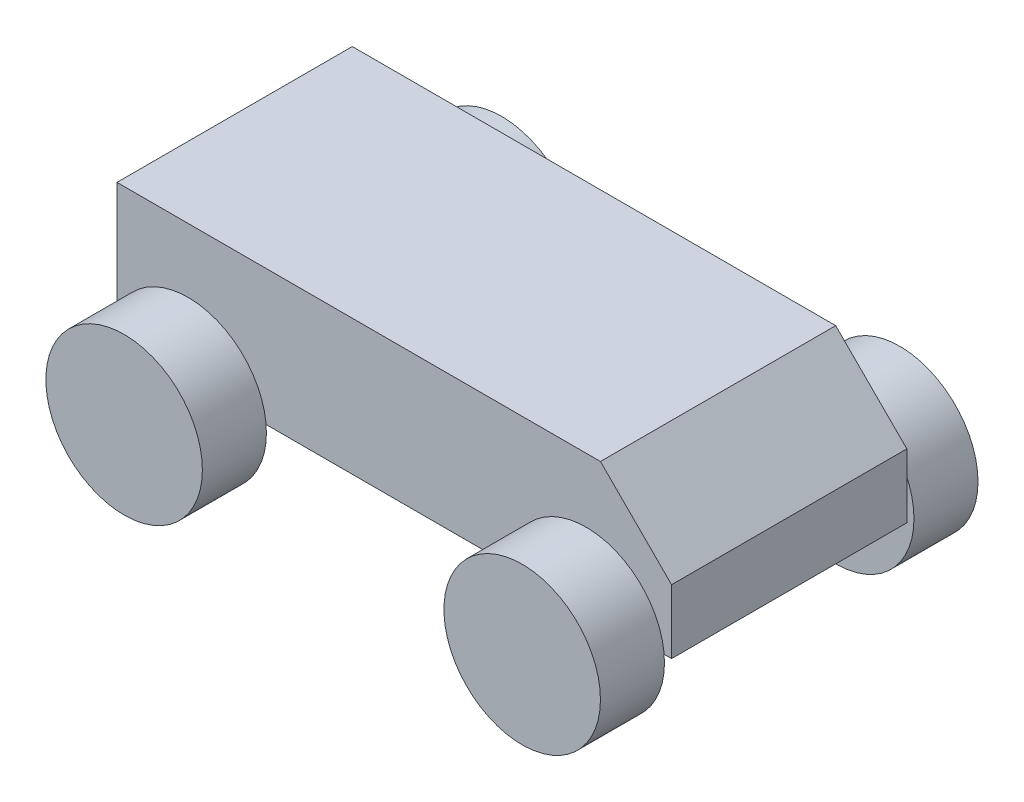
ISO-10303-21;
HEADER;
FILE_DESCRIPTION(('STEP AP214'),'2;1');
FILE_NAME('part.step','',(''),(''),'','','');
FILE_SCHEMA(('AUTOMOTIVE_DESIGN { 1 0 10303 214 1 1 1 1 }'));
ENDSEC;
DATA;
#1=APPLICATION_CONTEXT('core data for automotive mechanical design processes');
#2=APPLICATION_PROTOCOL_DEFINITION('international standard','automotive_design',2000,#1);
#3=PRODUCT_CONTEXT('',#1,'mechanical');
#4=PRODUCT('Part','Part','',(#3));
#5=PRODUCT_RELATED_PRODUCT_CATEGORY('part','',(#4));
#6=PRODUCT_DEFINITION_FORMATION('','',#4);
#7=PRODUCT_DEFINITION_CONTEXT('part definition',#1,'design');
#8=PRODUCT_DEFINITION('design','',#6,#7);
#9=PRODUCT_DEFINITION_SHAPE('','',#8);
#10=(LENGTH_UNIT() NAMED_UNIT(*) SI_UNIT(.MILLI.,.METRE.));
#11=(NAMED_UNIT(*) PLANE_ANGLE_UNIT() SI_UNIT($,.RADIAN.));
#12=(NAMED_UNIT(*) SI_UNIT($,.STERADIAN.) SOLID_ANGLE_UNIT());
#13=UNCERTAINTY_MEASURE_WITH_UNIT(LENGTH_MEASURE(1.E-05),#10,'distance_accuracy_value','');
#14=(GEOMETRIC_REPRESENTATION_CONTEXT(3) GLOBAL_UNCERTAINTY_ASSIGNED_CONTEXT((#13)) GLOBAL_UNIT_ASSIGNED_CONTEXT((#10,
#11,#12)) REPRESENTATION_CONTEXT('',''));
#15=CARTESIAN_POINT('',(0.,0.,0.));
#16=DIRECTION('',(0.,0.,1.));
#17=DIRECTION('',(1.,0.,0.));
#18=AXIS2_PLACEMENT_3D('',#15,#16,#17);
#19=CARTESIAN_POINT('',(355.3,0.,-408.842048968553));
#20=DIRECTION('',(0.,0.,1.));
#21=DIRECTION('',(1.,0.,0.));
#22=AXIS2_PLACEMENT_3D('',#19,#20,#21);
#23=CYLINDRICAL_SURFACE('',#22,25.4);
#24=CARTESIAN_POINT('',(355.3,0.,222.7));
#25=DIRECTION('',(0.,0.,1.));
#26=DIRECTION('',(1.,0.,0.));
#27=AXIS2_PLACEMENT_3D('',#24,#25,#26);
#28=CIRCLE('',#27,25.4);
#29=CARTESIAN_POINT('',(380.7,0.,222.7));
#30=VERTEX_POINT('',#29);
#31=EDGE_CURVE('E133',#30,#30,#28,.F.);
#32=ORIENTED_EDGE('',*,*,#31,.T.);
#33=EDGE_LOOP('',(#32));
#34=FACE_BOUND('',#33,.T.);
#35=DIRECTION('',(0.,0.,1.));
#36=VECTOR('',#35,1.);
#37=CARTESIAN_POINT('',(329.9,0.,-408.842048968553));
#38=LINE('',#37,#36);
#39=CARTESIAN_POINT('',(329.9,0.,-210.));
#40=VERTEX_POINT('',#39);
#41=CARTESIAN_POINT('',(329.9,0.,210.));
#42=VERTEX_POINT('',#41);
#43=EDGE_CURVE('E121',#40,#42,#38,.T.);
#44=ORIENTED_EDGE('',*,*,#43,.F.);
#45=CARTESIAN_POINT('',(355.3,0.,-210.));
#46=DIRECTION('',(0.,0.,1.));
#47=DIRECTION('',(1.,0.,0.));
#48=AXIS2_PLACEMENT_3D('',#45,#46,#47);
#49=CIRCLE('',#48,25.4);
#50=CARTESIAN_POINT('',(380.7,0.,-210.));
#51=VERTEX_POINT('',#50);
#52=EDGE_CURVE('E116',#51,#40,#49,.T.);
#53=ORIENTED_EDGE('',*,*,#52,.F.);
#54=DIRECTION('',(0.,0.,1.));
#55=VECTOR('',#54,1.);
#56=CARTESIAN_POINT('',(380.7,0.,-408.842048968553));
#57=LINE('',#56,#55);
#58=CARTESIAN_POINT('',(380.7,0.,210.));
#59=VERTEX_POINT('',#58);
#60=EDGE_CURVE('E110',#59,#51,#57,.F.);
#61=ORIENTED_EDGE('',*,*,#60,.F.);
#62=CARTESIAN_POINT('',(355.3,0.,210.));
#63=DIRECTION('',(0.,0.,-1.));
#64=DIRECTION('',(-1.,0.,0.));
#65=AXIS2_PLACEMENT_3D('',#62,#63,#64);
#66=CIRCLE('',#65,25.4);
#67=EDGE_CURVE('E113',#42,#59,#66,.T.);
#68=ORIENTED_EDGE('',*,*,#67,.F.);
#69=EDGE_LOOP('',(#44,#53,#61,#68));
#70=FACE_BOUND('',#69,.T.);
#71=CARTESIAN_POINT('',(355.3,0.,-222.7));
#72=DIRECTION('',(0.,0.,-1.));
#73=DIRECTION('',(-1.,0.,0.));
#74=AXIS2_PLACEMENT_3D('',#71,#72,#73);
#75=CIRCLE('',#74,25.4);
#76=CARTESIAN_POINT('',(329.9,0.,-222.7));
#77=VERTEX_POINT('',#76);
#78=EDGE_CURVE('E204',#77,#77,#75,.F.);
#79=ORIENTED_EDGE('',*,*,#78,.T.);
#80=EDGE_LOOP('',(#79));
#81=FACE_BOUND('',#80,.T.);
#82=ADVANCED_FACE('F41',(#34,#70,#81),#23,.T.);
#83=CARTESIAN_POINT('',(0.,0.,0.));
#84=DIRECTION('',(0.,1.,0.));
#85=DIRECTION('',(0.,0.,1.));
#86=AXIS2_PLACEMENT_3D('',#83,#84,#85);
#87=PLANE('',#86);
#88=DIRECTION('',(-1.,0.,0.));
#89=VECTOR('',#88,1.);
#90=CARTESIAN_POINT('',(-495.,0.,-210.));
#91=LINE('',#90,#89);
#92=CARTESIAN_POINT('',(-329.9,0.,-210.));
#93=VERTEX_POINT('',#92);
#94=EDGE_CURVE('E164',#40,#93,#91,.T.);
#95=ORIENTED_EDGE('',*,*,#94,.F.);
#96=ORIENTED_EDGE('',*,*,#43,.T.);
#97=DIRECTION('',(1.,0.,0.));
#98=VECTOR('',#97,1.);
#99=CARTESIAN_POINT('',(-495.,0.,210.));
#100=LINE('',#99,#98);
#101=CARTESIAN_POINT('',(-329.9,0.,210.));
#102=VERTEX_POINT('',#101);
#103=EDGE_CURVE('E132',#102,#42,#100,.T.);
#104=ORIENTED_EDGE('',*,*,#103,.F.);
#105=DIRECTION('',(0.,0.,1.));
#106=VECTOR('',#105,1.);
#107=CARTESIAN_POINT('',(-329.9,0.,-408.842048968553));
#108=LINE('',#107,#106);
#109=EDGE_CURVE('E183',#102,#93,#108,.F.);
#110=ORIENTED_EDGE('',*,*,#109,.T.);
#111=EDGE_LOOP('',(#95,#96,#104,#110));
#112=FACE_BOUND('',#111,.T.);
#113=ADVANCED_FACE('F226',(#112),#87,.F.);
#114=CARTESIAN_POINT('',(-355.3,0.,-408.842048968553));
#115=DIRECTION('',(0.,0.,1.));
#116=DIRECTION('',(1.,0.,0.));
#117=AXIS2_PLACEMENT_3D('',#114,#115,#116);
#118=CYLINDRICAL_SURFACE('',#117,25.4);
#119=CARTESIAN_POINT('',(-355.3,0.,222.7));
#120=DIRECTION('',(0.,0.,1.));
#121=DIRECTION('',(1.,0.,0.));
#122=AXIS2_PLACEMENT_3D('',#119,#120,#121);
#123=CIRCLE('',#122,25.4);
#124=CARTESIAN_POINT('',(-329.9,0.,222.7));
#125=VERTEX_POINT('',#124);
#126=EDGE_CURVE('E189',#125,#125,#123,.F.);
#127=ORIENTED_EDGE('',*,*,#126,.T.);
#128=EDGE_LOOP('',(#127));
#129=FACE_BOUND('',#128,.T.);
#130=DIRECTION('',(0.,0.,1.));
#131=VECTOR('',#130,1.);
#132=CARTESIAN_POINT('',(-380.7,0.,-408.842048968553));
#133=LINE('',#132,#131);
#134=CARTESIAN_POINT('',(-380.7,0.,-210.));
#135=VERTEX_POINT('',#134);
#136=CARTESIAN_POINT('',(-380.7,0.,210.));
#137=VERTEX_POINT('',#136);
#138=EDGE_CURVE('E122',#135,#137,#133,.T.);
#139=ORIENTED_EDGE('',*,*,#138,.F.);
#140=CARTESIAN_POINT('',(-355.3,0.,-210.));
#141=DIRECTION('',(0.,0.,1.));
#142=DIRECTION('',(1.,0.,0.));
#143=AXIS2_PLACEMENT_3D('',#140,#141,#142);
#144=CIRCLE('',#143,25.4);
#145=EDGE_CURVE('E156',#93,#135,#144,.T.);
#146=ORIENTED_EDGE('',*,*,#145,.F.);
#147=ORIENTED_EDGE('',*,*,#109,.F.);
#148=CARTESIAN_POINT('',(-355.3,0.,210.));
#149=DIRECTION('',(0.,0.,-1.));
#150=DIRECTION('',(-1.,0.,0.));
#151=AXIS2_PLACEMENT_3D('',#148,#149,#150);
#152=CIRCLE('',#151,25.4);
#153=EDGE_CURVE('E192',#137,#102,#152,.T.);
#154=ORIENTED_EDGE('',*,*,#153,.F.);
#155=EDGE_LOOP('',(#139,#146,#147,#154));
#156=FACE_BOUND('',#155,.T.);
#157=CARTESIAN_POINT('',(-355.3,0.,-222.7));
#158=DIRECTION('',(0.,0.,-1.));
#159=DIRECTION('',(-1.,0.,0.));
#160=AXIS2_PLACEMENT_3D('',#157,#158,#159);
#161=CIRCLE('',#160,25.4);
#162=CARTESIAN_POINT('',(-380.7,0.,-222.7));
#163=VERTEX_POINT('',#162);
#164=EDGE_CURVE('E194',#163,#163,#161,.F.);
#165=ORIENTED_EDGE('',*,*,#164,.T.);
#166=EDGE_LOOP('',(#165));
#167=FACE_BOUND('',#166,.T.);
#168=ADVANCED_FACE('F224',(#129,#156,#167),#118,.T.);
#169=CARTESIAN_POINT('',(-495.,0.,-210.));
#170=VERTEX_POINT('',#169);
#171=EDGE_CURVE('E163',#135,#170,#91,.T.);
#172=ORIENTED_EDGE('',*,*,#171,.F.);
#173=ORIENTED_EDGE('',*,*,#138,.T.);
#174=CARTESIAN_POINT('',(-495.,0.,210.));
#175=VERTEX_POINT('',#174);
#176=EDGE_CURVE('E140',#175,#137,#100,.T.);
#177=ORIENTED_EDGE('',*,*,#176,.F.);
#178=DIRECTION('',(0.,0.,1.));
#179=VECTOR('',#178,1.);
#180=CARTESIAN_POINT('',(-495.,0.,-210.));
#181=LINE('',#180,#179);
#182=EDGE_CURVE('E138',#170,#175,#181,.T.);
#183=ORIENTED_EDGE('',*,*,#182,.F.);
#184=EDGE_LOOP('',(#172,#173,#177,#183));
#185=FACE_BOUND('',#184,.T.);
#186=ADVANCED_FACE('F181',(#185),#87,.F.);
#187=CARTESIAN_POINT('',(495.,241.3,-210.));
#188=DIRECTION('',(-1.,0.,0.));
#189=DIRECTION('',(0.,0.,1.));
#190=AXIS2_PLACEMENT_3D('',#187,#188,#189);
#191=PLANE('',#190);
#192=DIRECTION('',(0.,-1.,0.));
#193=VECTOR('',#192,1.);
#194=CARTESIAN_POINT('',(495.,241.3,-210.));
#195=LINE('',#194,#193);
#196=CARTESIAN_POINT('',(495.,114.299999999999,-210.));
#197=VERTEX_POINT('',#196);
#198=CARTESIAN_POINT('',(495.,0.,-210.));
#199=VERTEX_POINT('',#198);
#200=EDGE_CURVE('E178',#197,#199,#195,.T.);
#201=ORIENTED_EDGE('',*,*,#200,.F.);
#202=DIRECTION('',(0.,0.,1.));
#203=VECTOR('',#202,1.);
#204=CARTESIAN_POINT('',(495.,114.299999999999,210.));
#205=LINE('',#204,#203);
#206=CARTESIAN_POINT('',(495.,114.299999999999,210.));
#207=VERTEX_POINT('',#206);
#208=EDGE_CURVE('E50',#197,#207,#205,.T.);
#209=ORIENTED_EDGE('',*,*,#208,.T.);
#210=DIRECTION('',(0.,-1.,0.));
#211=VECTOR('',#210,1.);
#212=CARTESIAN_POINT('',(495.,241.3,210.));
#213=LINE('',#212,#211);
#214=CARTESIAN_POINT('',(495.,0.,210.));
#215=VERTEX_POINT('',#214);
#216=EDGE_CURVE('E161',#207,#215,#213,.T.);
#217=ORIENTED_EDGE('',*,*,#216,.T.);
#218=DIRECTION('',(0.,0.,-1.));
#219=VECTOR('',#218,1.);
#220=CARTESIAN_POINT('',(495.,0.,-210.));
#221=LINE('',#220,#219);
#222=EDGE_CURVE('E137',#215,#199,#221,.T.);
#223=ORIENTED_EDGE('',*,*,#222,.T.);
#224=EDGE_LOOP('',(#201,#209,#217,#223));
#225=FACE_BOUND('',#224,.T.);
#226=ADVANCED_FACE('F216',(#225),#191,.F.);
#227=CARTESIAN_POINT('',(-495.,241.3,-210.));
#228=DIRECTION('',(0.,0.,1.));
#229=DIRECTION('',(1.,0.,0.));
#230=AXIS2_PLACEMENT_3D('',#227,#228,#229);
#231=PLANE('',#230);
#232=DIRECTION('',(-1.,0.,0.));
#233=VECTOR('',#232,1.);
#234=CARTESIAN_POINT('',(-495.,241.3,-210.));
#235=LINE('',#234,#233);
#236=CARTESIAN_POINT('',(368.,241.3,-210.));
#237=VERTEX_POINT('',#236);
#238=CARTESIAN_POINT('',(-495.,241.3,-210.));
#239=VERTEX_POINT('',#238);
#240=EDGE_CURVE('E145',#237,#239,#235,.T.);
#241=ORIENTED_EDGE('',*,*,#240,.F.);
#242=DIRECTION('',(0.707106781186546,-0.707106781186549,0.));
#243=VECTOR('',#242,1.);
#244=CARTESIAN_POINT('',(368.,241.3,-210.));
#245=LINE('',#244,#243);
#246=EDGE_CURVE('E64',#237,#197,#245,.T.);
#247=ORIENTED_EDGE('',*,*,#246,.T.);
#248=ORIENTED_EDGE('',*,*,#200,.T.);
#249=EDGE_CURVE('E141',#199,#51,#91,.T.);
#250=ORIENTED_EDGE('',*,*,#249,.T.);
#251=ORIENTED_EDGE('',*,*,#52,.T.);
#252=ORIENTED_EDGE('',*,*,#94,.T.);
#253=ORIENTED_EDGE('',*,*,#145,.T.);
#254=ORIENTED_EDGE('',*,*,#171,.T.);
#255=DIRECTION('',(0.,-1.,0.));
#256=VECTOR('',#255,1.);
#257=CARTESIAN_POINT('',(-495.,241.3,-210.));
#258=LINE('',#257,#256);
#259=EDGE_CURVE('E169',#239,#170,#258,.T.);
#260=ORIENTED_EDGE('',*,*,#259,.F.);
#261=EDGE_LOOP('',(#241,#247,#248,#250,#251,#252,#253,#254,#260));
#262=FACE_BOUND('',#261,.T.);
#263=ADVANCED_FACE('F168',(#262),#231,.F.);
#264=CARTESIAN_POINT('',(-495.,241.3,-210.));
#265=DIRECTION('',(1.,0.,0.));
#266=DIRECTION('',(0.,0.,-1.));
#267=AXIS2_PLACEMENT_3D('',#264,#265,#266);
#268=PLANE('',#267);
#269=ORIENTED_EDGE('',*,*,#182,.T.);
#270=DIRECTION('',(0.,-1.,0.));
#271=VECTOR('',#270,1.);
#272=CARTESIAN_POINT('',(-495.,241.3,210.));
#273=LINE('',#272,#271);
#274=CARTESIAN_POINT('',(-495.,241.3,210.));
#275=VERTEX_POINT('',#274);
#276=EDGE_CURVE('E179',#275,#175,#273,.T.);
#277=ORIENTED_EDGE('',*,*,#276,.F.);
#278=DIRECTION('',(0.,0.,1.));
#279=VECTOR('',#278,1.);
#280=CARTESIAN_POINT('',(-495.,241.3,-210.));
#281=LINE('',#280,#279);
#282=EDGE_CURVE('E148',#239,#275,#281,.T.);
#283=ORIENTED_EDGE('',*,*,#282,.F.);
#284=ORIENTED_EDGE('',*,*,#259,.T.);
#285=EDGE_LOOP('',(#269,#277,#283,#284));
#286=FACE_BOUND('',#285,.T.);
#287=ADVANCED_FACE('F176',(#286),#268,.F.);
#288=CARTESIAN_POINT('',(-495.,241.3,210.));
#289=DIRECTION('',(0.,0.,-1.));
#290=DIRECTION('',(-1.,0.,0.));
#291=AXIS2_PLACEMENT_3D('',#288,#289,#290);
#292=PLANE('',#291);
#293=ORIENTED_EDGE('',*,*,#216,.F.);
#294=DIRECTION('',(-0.707106781186546,0.707106781186549,0.));
#295=VECTOR('',#294,1.);
#296=CARTESIAN_POINT('',(368.,241.3,210.));
#297=LINE('',#296,#295);
#298=CARTESIAN_POINT('',(368.,241.3,210.));
#299=VERTEX_POINT('',#298);
#300=EDGE_CURVE('E11',#207,#299,#297,.T.);
#301=ORIENTED_EDGE('',*,*,#300,.T.);
#302=DIRECTION('',(1.,0.,0.));
#303=VECTOR('',#302,1.);
#304=CARTESIAN_POINT('',(-495.,241.3,210.));
#305=LINE('',#304,#303);
#306=EDGE_CURVE('E153',#275,#299,#305,.T.);
#307=ORIENTED_EDGE('',*,*,#306,.F.);
#308=ORIENTED_EDGE('',*,*,#276,.T.);
#309=ORIENTED_EDGE('',*,*,#176,.T.);
#310=ORIENTED_EDGE('',*,*,#153,.T.);
#311=ORIENTED_EDGE('',*,*,#103,.T.);
#312=ORIENTED_EDGE('',*,*,#67,.T.);
#313=EDGE_CURVE('E128',#59,#215,#100,.T.);
#314=ORIENTED_EDGE('',*,*,#313,.T.);
#315=EDGE_LOOP('',(#293,#301,#307,#308,#309,#310,#311,#312,#314));
#316=FACE_BOUND('',#315,.T.);
#317=ADVANCED_FACE('F127',(#316),#292,.F.);
#318=CARTESIAN_POINT('',(0.,241.3,0.));
#319=DIRECTION('',(0.,1.,0.));
#320=DIRECTION('',(0.,0.,1.));
#321=AXIS2_PLACEMENT_3D('',#318,#319,#320);
#322=PLANE('',#321);
#323=ORIENTED_EDGE('',*,*,#306,.T.);
#324=DIRECTION('',(0.,0.,-1.));
#325=VECTOR('',#324,1.);
#326=CARTESIAN_POINT('',(368.,241.3,-210.));
#327=LINE('',#326,#325);
#328=EDGE_CURVE('E200',#299,#237,#327,.T.);
#329=ORIENTED_EDGE('',*,*,#328,.T.);
#330=ORIENTED_EDGE('',*,*,#240,.T.);
#331=ORIENTED_EDGE('',*,*,#282,.T.);
#332=EDGE_LOOP('',(#323,#329,#330,#331));
#333=FACE_BOUND('',#332,.T.);
#334=ADVANCED_FACE('F211',(#333),#322,.T.);
#335=ORIENTED_EDGE('',*,*,#313,.F.);
#336=ORIENTED_EDGE('',*,*,#60,.T.);
#337=ORIENTED_EDGE('',*,*,#249,.F.);
#338=ORIENTED_EDGE('',*,*,#222,.F.);
#339=EDGE_LOOP('',(#335,#336,#337,#338));
#340=FACE_BOUND('',#339,.T.);
#341=ADVANCED_FACE('F135',(#340),#87,.F.);
#342=CARTESIAN_POINT('',(-355.3,0.,337.));
#343=DIRECTION('',(0.,0.,-1.));
#344=DIRECTION('',(-1.,0.,0.));
#345=AXIS2_PLACEMENT_3D('',#342,#343,#344);
#346=CYLINDRICAL_SURFACE('',#345,139.7);
#347=CARTESIAN_POINT('',(-355.3,0.,337.));
#348=DIRECTION('',(0.,0.,1.));
#349=DIRECTION('',(1.,0.,0.));
#350=AXIS2_PLACEMENT_3D('',#347,#348,#349);
#351=CIRCLE('',#350,139.7);
#352=CARTESIAN_POINT('',(-215.6,0.,337.));
#353=VERTEX_POINT('',#352);
#354=EDGE_CURVE('E193',#353,#353,#351,.T.);
#355=ORIENTED_EDGE('',*,*,#354,.F.);
#356=EDGE_LOOP('',(#355));
#357=FACE_BOUND('',#356,.T.);
#358=CARTESIAN_POINT('',(-355.3,0.,222.7));
#359=DIRECTION('',(0.,0.,1.));
#360=DIRECTION('',(1.,0.,0.));
#361=AXIS2_PLACEMENT_3D('',#358,#359,#360);
#362=CIRCLE('',#361,139.7);
#363=CARTESIAN_POINT('',(-215.6,0.,222.7));
#364=VERTEX_POINT('',#363);
#365=EDGE_CURVE('E196',#364,#364,#362,.T.);
#366=ORIENTED_EDGE('',*,*,#365,.T.);
#367=EDGE_LOOP('',(#366));
#368=FACE_BOUND('',#367,.T.);
#369=ADVANCED_FACE('F258',(#357,#368),#346,.T.);
#370=CARTESIAN_POINT('',(-355.3,0.,222.7));
#371=DIRECTION('',(0.,0.,1.));
#372=DIRECTION('',(1.,0.,0.));
#373=AXIS2_PLACEMENT_3D('',#370,#371,#372);
#374=PLANE('',#373);
#375=ORIENTED_EDGE('',*,*,#126,.F.);
#376=EDGE_LOOP('',(#375));
#377=FACE_BOUND('',#376,.T.);
#378=ORIENTED_EDGE('',*,*,#365,.F.);
#379=EDGE_LOOP('',(#378));
#380=FACE_BOUND('',#379,.T.);
#381=ADVANCED_FACE('F255',(#377,#380),#374,.F.);
#382=CARTESIAN_POINT('',(-355.3,0.,337.));
#383=DIRECTION('',(0.,0.,1.));
#384=DIRECTION('',(1.,0.,0.));
#385=AXIS2_PLACEMENT_3D('',#382,#383,#384);
#386=PLANE('',#385);
#387=ORIENTED_EDGE('',*,*,#354,.T.);
#388=EDGE_LOOP('',(#387));
#389=FACE_BOUND('',#388,.T.);
#390=ADVANCED_FACE('F253',(#389),#386,.T.);
#391=CARTESIAN_POINT('',(-355.3,0.,-337.));
#392=DIRECTION('',(0.,0.,1.));
#393=DIRECTION('',(-1.,0.,0.));
#394=AXIS2_PLACEMENT_3D('',#391,#392,#393);
#395=CYLINDRICAL_SURFACE('',#394,139.7);
#396=CARTESIAN_POINT('',(-355.3,0.,-337.));
#397=DIRECTION('',(0.,0.,1.));
#398=DIRECTION('',(1.,0.,0.));
#399=AXIS2_PLACEMENT_3D('',#396,#397,#398);
#400=CIRCLE('',#399,139.7);
#401=CARTESIAN_POINT('',(-215.6,0.,-337.));
#402=VERTEX_POINT('',#401);
#403=EDGE_CURVE('E197',#402,#402,#400,.T.);
#404=ORIENTED_EDGE('',*,*,#403,.T.);
#405=EDGE_LOOP('',(#404));
#406=FACE_BOUND('',#405,.T.);
#407=CARTESIAN_POINT('',(-355.3,0.,-222.7));
#408=DIRECTION('',(0.,0.,1.));
#409=DIRECTION('',(1.,0.,0.));
#410=AXIS2_PLACEMENT_3D('',#407,#408,#409);
#411=CIRCLE('',#410,139.7);
#412=CARTESIAN_POINT('',(-215.6,0.,-222.7));
#413=VERTEX_POINT('',#412);
#414=EDGE_CURVE('E444',#413,#413,#411,.T.);
#415=ORIENTED_EDGE('',*,*,#414,.F.);
#416=EDGE_LOOP('',(#415));
#417=FACE_BOUND('',#416,.T.);
#418=ADVANCED_FACE('F249',(#406,#417),#395,.T.);
#419=CARTESIAN_POINT('',(-355.3,0.,-222.7));
#420=DIRECTION('',(0.,0.,-1.));
#421=DIRECTION('',(1.,0.,0.));
#422=AXIS2_PLACEMENT_3D('',#419,#420,#421);
#423=PLANE('',#422);
#424=ORIENTED_EDGE('',*,*,#164,.F.);
#425=EDGE_LOOP('',(#424));
#426=FACE_BOUND('',#425,.T.);
#427=ORIENTED_EDGE('',*,*,#414,.T.);
#428=EDGE_LOOP('',(#427));
#429=FACE_BOUND('',#428,.T.);
#430=ADVANCED_FACE('F245',(#426,#429),#423,.F.);
#431=CARTESIAN_POINT('',(355.3,0.,-337.));
#432=DIRECTION('',(0.,0.,-1.));
#433=DIRECTION('',(1.,0.,0.));
#434=AXIS2_PLACEMENT_3D('',#431,#432,#433);
#435=PLANE('',#434);
#436=ORIENTED_EDGE('',*,*,#403,.F.);
#437=EDGE_LOOP('',(#436));
#438=FACE_BOUND('',#437,.T.);
#439=ADVANCED_FACE('F248',(#438),#435,.T.);
#440=CARTESIAN_POINT('',(355.3,0.,337.));
#441=DIRECTION('',(0.,0.,-1.));
#442=DIRECTION('',(-1.,0.,0.));
#443=AXIS2_PLACEMENT_3D('',#440,#441,#442);
#444=CYLINDRICAL_SURFACE('',#443,139.7);
#445=CARTESIAN_POINT('',(355.3,0.,337.));
#446=DIRECTION('',(0.,0.,1.));
#447=DIRECTION('',(1.,0.,0.));
#448=AXIS2_PLACEMENT_3D('',#445,#446,#447);
#449=CIRCLE('',#448,139.7);
#450=CARTESIAN_POINT('',(495.,0.,337.));
#451=VERTEX_POINT('',#450);
#452=EDGE_CURVE('E207',#451,#451,#449,.T.);
#453=ORIENTED_EDGE('',*,*,#452,.F.);
#454=EDGE_LOOP('',(#453));
#455=FACE_BOUND('',#454,.T.);
#456=CARTESIAN_POINT('',(355.3,0.,222.7));
#457=DIRECTION('',(0.,0.,1.));
#458=DIRECTION('',(1.,0.,0.));
#459=AXIS2_PLACEMENT_3D('',#456,#457,#458);
#460=CIRCLE('',#459,139.7);
#461=CARTESIAN_POINT('',(495.,0.,222.7));
#462=VERTEX_POINT('',#461);
#463=EDGE_CURVE('E203',#462,#462,#460,.T.);
#464=ORIENTED_EDGE('',*,*,#463,.T.);
#465=EDGE_LOOP('',(#464));
#466=FACE_BOUND('',#465,.T.);
#467=ADVANCED_FACE('F271',(#455,#466),#444,.T.);
#468=CARTESIAN_POINT('',(355.3,0.,222.7));
#469=DIRECTION('',(0.,0.,1.));
#470=DIRECTION('',(1.,0.,0.));
#471=AXIS2_PLACEMENT_3D('',#468,#469,#470);
#472=PLANE('',#471);
#473=ORIENTED_EDGE('',*,*,#31,.F.);
#474=EDGE_LOOP('',(#473));
#475=FACE_BOUND('',#474,.T.);
#476=ORIENTED_EDGE('',*,*,#463,.F.);
#477=EDGE_LOOP('',(#476));
#478=FACE_BOUND('',#477,.T.);
#479=ADVANCED_FACE('F243',(#475,#478),#472,.F.);
#480=CARTESIAN_POINT('',(355.3,0.,337.));
#481=DIRECTION('',(0.,0.,1.));
#482=DIRECTION('',(1.,0.,0.));
#483=AXIS2_PLACEMENT_3D('',#480,#481,#482);
#484=PLANE('',#483);
#485=ORIENTED_EDGE('',*,*,#452,.T.);
#486=EDGE_LOOP('',(#485));
#487=FACE_BOUND('',#486,.T.);
#488=ADVANCED_FACE('F239',(#487),#484,.T.);
#489=CARTESIAN_POINT('',(355.3,0.,-337.));
#490=DIRECTION('',(0.,0.,1.));
#491=DIRECTION('',(-1.,0.,0.));
#492=AXIS2_PLACEMENT_3D('',#489,#490,#491);
#493=CYLINDRICAL_SURFACE('',#492,139.7);
#494=CARTESIAN_POINT('',(355.3,0.,-337.));
#495=DIRECTION('',(0.,0.,1.));
#496=DIRECTION('',(1.,0.,0.));
#497=AXIS2_PLACEMENT_3D('',#494,#495,#496);
#498=CIRCLE('',#497,139.7);
#499=CARTESIAN_POINT('',(495.,0.,-337.));
#500=VERTEX_POINT('',#499);
#501=EDGE_CURVE('E434',#500,#500,#498,.T.);
#502=ORIENTED_EDGE('',*,*,#501,.T.);
#503=EDGE_LOOP('',(#502));
#504=FACE_BOUND('',#503,.T.);
#505=CARTESIAN_POINT('',(355.3,0.,-222.7));
#506=DIRECTION('',(0.,0.,1.));
#507=DIRECTION('',(1.,0.,0.));
#508=AXIS2_PLACEMENT_3D('',#505,#506,#507);
#509=CIRCLE('',#508,139.7);
#510=CARTESIAN_POINT('',(495.,0.,-222.7));
#511=VERTEX_POINT('',#510);
#512=EDGE_CURVE('E208',#511,#511,#509,.T.);
#513=ORIENTED_EDGE('',*,*,#512,.F.);
#514=EDGE_LOOP('',(#513));
#515=FACE_BOUND('',#514,.T.);
#516=ADVANCED_FACE('F242',(#504,#515),#493,.T.);
#517=CARTESIAN_POINT('',(355.3,0.,-222.7));
#518=DIRECTION('',(0.,0.,-1.));
#519=DIRECTION('',(1.,0.,0.));
#520=AXIS2_PLACEMENT_3D('',#517,#518,#519);
#521=PLANE('',#520);
#522=ORIENTED_EDGE('',*,*,#78,.F.);
#523=EDGE_LOOP('',(#522));
#524=FACE_BOUND('',#523,.T.);
#525=ORIENTED_EDGE('',*,*,#512,.T.);
#526=EDGE_LOOP('',(#525));
#527=FACE_BOUND('',#526,.T.);
#528=ADVANCED_FACE('F384',(#524,#527),#521,.F.);
#529=CARTESIAN_POINT('',(355.3,0.,-337.));
#530=DIRECTION('',(0.,0.,-1.));
#531=DIRECTION('',(1.,0.,0.));
#532=AXIS2_PLACEMENT_3D('',#529,#530,#531);
#533=PLANE('',#532);
#534=ORIENTED_EDGE('',*,*,#501,.F.);
#535=EDGE_LOOP('',(#534));
#536=FACE_BOUND('',#535,.T.);
#537=ADVANCED_FACE('F237',(#536),#533,.T.);
#538=CARTESIAN_POINT('',(368.,241.3,0.));
#539=DIRECTION('',(0.707106781186549,0.707106781186546,0.));
#540=DIRECTION('',(0.,0.,1.));
#541=AXIS2_PLACEMENT_3D('',#538,#539,#540);
#542=PLANE('',#541);
#543=ORIENTED_EDGE('',*,*,#300,.F.);
#544=ORIENTED_EDGE('',*,*,#208,.F.);
#545=ORIENTED_EDGE('',*,*,#246,.F.);
#546=ORIENTED_EDGE('',*,*,#328,.F.);
#547=EDGE_LOOP('',(#543,#544,#545,#546));
#548=FACE_BOUND('',#547,.T.);
#549=ADVANCED_FACE('F44',(#548),#542,.T.);
#550=CLOSED_SHELL('',(#82,#113,#168,#186,#226,#263,#287,#317,#334,#341,#369,#381,#390,#418,#430,
#439,#467,#479,#488,#516,#528,#537,#549));
#551=MANIFOLD_SOLID_BREP('B2',#550);
#552=ADVANCED_BREP_SHAPE_REPRESENTATION('',(#18,#551),#14);
#553=SHAPE_DEFINITION_REPRESENTATION(#9,#552);
ENDSEC;
END-ISO-10303-21;
